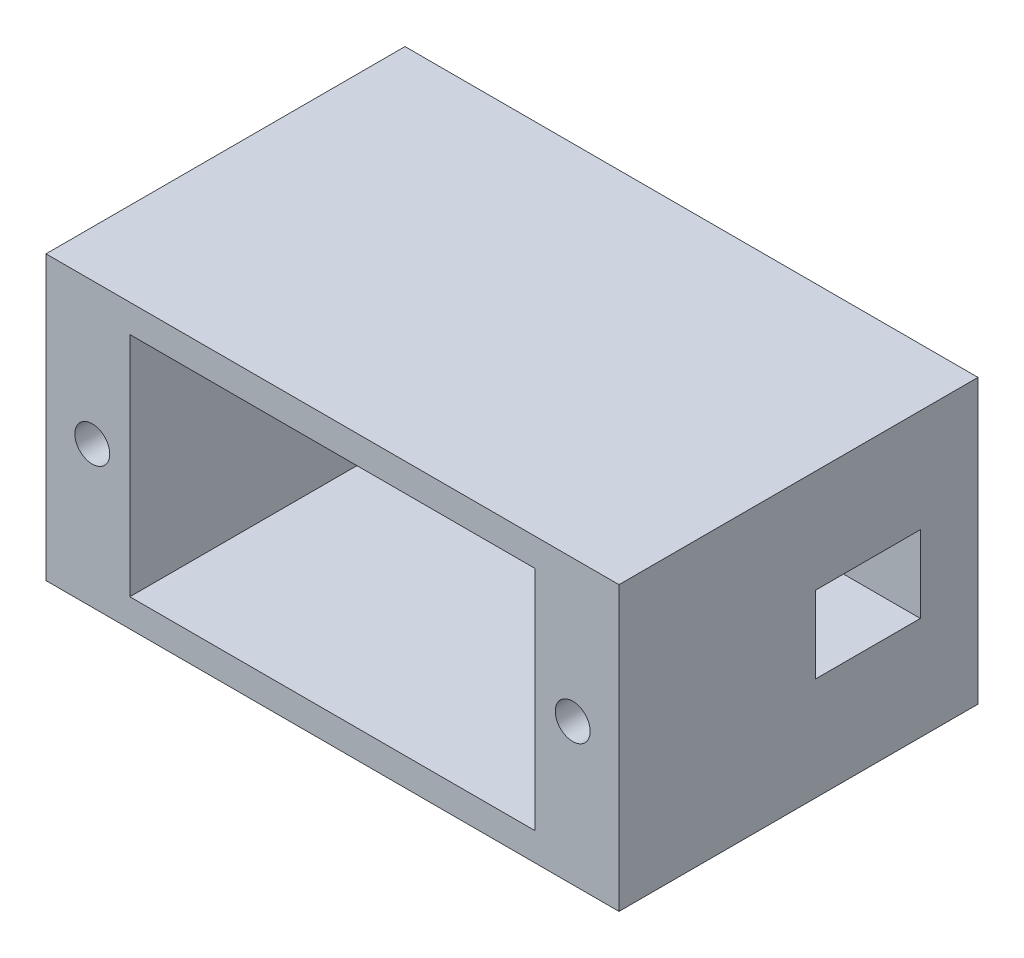
ISO-10303-21;
HEADER;
FILE_DESCRIPTION(('STEP AP214'),'2;1');
FILE_NAME('part.step','',(''),(''),'','','');
FILE_SCHEMA(('AUTOMOTIVE_DESIGN { 1 0 10303 214 1 1 1 1 }'));
ENDSEC;
DATA;
#1=APPLICATION_CONTEXT('core data for automotive mechanical design processes');
#2=APPLICATION_PROTOCOL_DEFINITION('international standard','automotive_design',2000,#1);
#3=PRODUCT_CONTEXT('',#1,'mechanical');
#4=PRODUCT('Part','Part','',(#3));
#5=PRODUCT_RELATED_PRODUCT_CATEGORY('part','',(#4));
#6=PRODUCT_DEFINITION_FORMATION('','',#4);
#7=PRODUCT_DEFINITION_CONTEXT('part definition',#1,'design');
#8=PRODUCT_DEFINITION('design','',#6,#7);
#9=PRODUCT_DEFINITION_SHAPE('','',#8);
#10=(LENGTH_UNIT() NAMED_UNIT(*) SI_UNIT(.MILLI.,.METRE.));
#11=(NAMED_UNIT(*) PLANE_ANGLE_UNIT() SI_UNIT($,.RADIAN.));
#12=(NAMED_UNIT(*) SI_UNIT($,.STERADIAN.) SOLID_ANGLE_UNIT());
#13=UNCERTAINTY_MEASURE_WITH_UNIT(LENGTH_MEASURE(1.E-05),#10,'distance_accuracy_value','');
#14=(GEOMETRIC_REPRESENTATION_CONTEXT(3) GLOBAL_UNCERTAINTY_ASSIGNED_CONTEXT((#13)) GLOBAL_UNIT_ASSIGNED_CONTEXT((#10,
#11,#12)) REPRESENTATION_CONTEXT('',''));
#15=CARTESIAN_POINT('',(0.,0.,0.));
#16=DIRECTION('',(0.,0.,1.));
#17=DIRECTION('',(1.,0.,0.));
#18=AXIS2_PLACEMENT_3D('',#15,#16,#17);
#19=CARTESIAN_POINT('',(-16.4,-8.1,5.15));
#20=DIRECTION('',(1.,0.,0.));
#21=DIRECTION('',(0.,0.,-1.));
#22=AXIS2_PLACEMENT_3D('',#19,#20,#21);
#23=PLANE('',#22);
#24=DIRECTION('',(0.,-1.,0.));
#25=VECTOR('',#24,1.);
#26=CARTESIAN_POINT('',(-16.4,-8.1,-15.4));
#27=LINE('',#26,#25);
#28=CARTESIAN_POINT('',(-16.4,8.1,-15.4));
#29=VERTEX_POINT('',#28);
#30=CARTESIAN_POINT('',(-16.4,-8.1,-15.4));
#31=VERTEX_POINT('',#30);
#32=EDGE_CURVE('E232',#29,#31,#27,.T.);
#33=ORIENTED_EDGE('',*,*,#32,.T.);
#34=DIRECTION('',(0.,0.,-1.));
#35=VECTOR('',#34,1.);
#36=CARTESIAN_POINT('',(-16.4,-8.1,5.15));
#37=LINE('',#36,#35);
#38=CARTESIAN_POINT('',(-16.4,-8.1,5.15));
#39=VERTEX_POINT('',#38);
#40=EDGE_CURVE('E11',#39,#31,#37,.T.);
#41=ORIENTED_EDGE('',*,*,#40,.F.);
#42=DIRECTION('',(0.,-1.,0.));
#43=VECTOR('',#42,1.);
#44=CARTESIAN_POINT('',(-16.4,-8.1,5.15));
#45=LINE('',#44,#43);
#46=CARTESIAN_POINT('',(-16.4,8.1,5.15));
#47=VERTEX_POINT('',#46);
#48=EDGE_CURVE('E242',#47,#39,#45,.T.);
#49=ORIENTED_EDGE('',*,*,#48,.F.);
#50=DIRECTION('',(0.,0.,-1.));
#51=VECTOR('',#50,1.);
#52=CARTESIAN_POINT('',(-16.4,8.1,5.15));
#53=LINE('',#52,#51);
#54=EDGE_CURVE('E256',#47,#29,#53,.T.);
#55=ORIENTED_EDGE('',*,*,#54,.T.);
#56=EDGE_LOOP('',(#33,#41,#49,#55));
#57=FACE_BOUND('',#56,.T.);
#58=ADVANCED_FACE('F39',(#57),#23,.F.);
#59=CARTESIAN_POINT('',(-16.4,-8.1,5.15));
#60=DIRECTION('',(0.,1.,0.));
#61=DIRECTION('',(0.,0.,1.));
#62=AXIS2_PLACEMENT_3D('',#59,#60,#61);
#63=PLANE('',#62);
#64=DIRECTION('',(1.,0.,0.));
#65=VECTOR('',#64,1.);
#66=CARTESIAN_POINT('',(-16.4,-8.1,-15.4));
#67=LINE('',#66,#65);
#68=CARTESIAN_POINT('',(16.4,-8.1,-15.4));
#69=VERTEX_POINT('',#68);
#70=EDGE_CURVE('E260',#31,#69,#67,.T.);
#71=ORIENTED_EDGE('',*,*,#70,.T.);
#72=DIRECTION('',(0.,0.,-1.));
#73=VECTOR('',#72,1.);
#74=CARTESIAN_POINT('',(16.4,-8.1,5.15));
#75=LINE('',#74,#73);
#76=CARTESIAN_POINT('',(16.4,-8.1,5.15));
#77=VERTEX_POINT('',#76);
#78=EDGE_CURVE('E47',#77,#69,#75,.T.);
#79=ORIENTED_EDGE('',*,*,#78,.F.);
#80=DIRECTION('',(1.,0.,0.));
#81=VECTOR('',#80,1.);
#82=CARTESIAN_POINT('',(-16.4,-8.1,5.15));
#83=LINE('',#82,#81);
#84=EDGE_CURVE('E246',#39,#77,#83,.T.);
#85=ORIENTED_EDGE('',*,*,#84,.F.);
#86=ORIENTED_EDGE('',*,*,#40,.T.);
#87=EDGE_LOOP('',(#71,#79,#85,#86));
#88=FACE_BOUND('',#87,.T.);
#89=ADVANCED_FACE('F296',(#88),#63,.F.);
#90=CARTESIAN_POINT('',(16.4,-8.1,5.15));
#91=DIRECTION('',(-1.,0.,0.));
#92=DIRECTION('',(0.,0.,1.));
#93=AXIS2_PLACEMENT_3D('',#90,#91,#92);
#94=PLANE('',#93);
#95=DIRECTION('',(0.,0.,-1.));
#96=VECTOR('',#95,1.);
#97=CARTESIAN_POINT('',(16.4,-2.2,-6.1));
#98=LINE('',#97,#96);
#99=CARTESIAN_POINT('',(16.4,-2.2,-6.1));
#100=VERTEX_POINT('',#99);
#101=CARTESIAN_POINT('',(16.4,-2.2,-12.1));
#102=VERTEX_POINT('',#101);
#103=EDGE_CURVE('E159',#100,#102,#98,.T.);
#104=ORIENTED_EDGE('',*,*,#103,.F.);
#105=DIRECTION('',(0.,-1.,0.));
#106=VECTOR('',#105,1.);
#107=CARTESIAN_POINT('',(16.4,-2.2,-6.1));
#108=LINE('',#107,#106);
#109=CARTESIAN_POINT('',(16.4,2.2,-6.1));
#110=VERTEX_POINT('',#109);
#111=EDGE_CURVE('E54',#110,#100,#108,.T.);
#112=ORIENTED_EDGE('',*,*,#111,.F.);
#113=DIRECTION('',(0.,0.,1.));
#114=VECTOR('',#113,1.);
#115=CARTESIAN_POINT('',(16.4,2.2,-6.1));
#116=LINE('',#115,#114);
#117=CARTESIAN_POINT('',(16.4,2.2,-12.1));
#118=VERTEX_POINT('',#117);
#119=EDGE_CURVE('E148',#118,#110,#116,.T.);
#120=ORIENTED_EDGE('',*,*,#119,.F.);
#121=DIRECTION('',(0.,1.,0.));
#122=VECTOR('',#121,1.);
#123=CARTESIAN_POINT('',(16.4,-2.2,-12.1));
#124=LINE('',#123,#122);
#125=EDGE_CURVE('E152',#102,#118,#124,.T.);
#126=ORIENTED_EDGE('',*,*,#125,.F.);
#127=EDGE_LOOP('',(#104,#112,#120,#126));
#128=FACE_BOUND('',#127,.T.);
#129=DIRECTION('',(0.,1.,0.));
#130=VECTOR('',#129,1.);
#131=CARTESIAN_POINT('',(16.4,-8.1,-15.4));
#132=LINE('',#131,#130);
#133=CARTESIAN_POINT('',(16.4,8.1,-15.4));
#134=VERTEX_POINT('',#133);
#135=EDGE_CURVE('E263',#69,#134,#132,.T.);
#136=ORIENTED_EDGE('',*,*,#135,.T.);
#137=DIRECTION('',(0.,0.,-1.));
#138=VECTOR('',#137,1.);
#139=CARTESIAN_POINT('',(16.4,8.1,5.15));
#140=LINE('',#139,#138);
#141=CARTESIAN_POINT('',(16.4,8.1,5.15));
#142=VERTEX_POINT('',#141);
#143=EDGE_CURVE('E271',#142,#134,#140,.T.);
#144=ORIENTED_EDGE('',*,*,#143,.F.);
#145=DIRECTION('',(0.,1.,0.));
#146=VECTOR('',#145,1.);
#147=CARTESIAN_POINT('',(16.4,-8.1,5.15));
#148=LINE('',#147,#146);
#149=EDGE_CURVE('E250',#77,#142,#148,.T.);
#150=ORIENTED_EDGE('',*,*,#149,.F.);
#151=ORIENTED_EDGE('',*,*,#78,.T.);
#152=EDGE_LOOP('',(#136,#144,#150,#151));
#153=FACE_BOUND('',#152,.T.);
#154=ADVANCED_FACE('F280',(#128,#153),#94,.F.);
#155=CARTESIAN_POINT('',(-16.4,8.1,5.15));
#156=DIRECTION('',(0.,-1.,0.));
#157=DIRECTION('',(0.,0.,-1.));
#158=AXIS2_PLACEMENT_3D('',#155,#156,#157);
#159=PLANE('',#158);
#160=DIRECTION('',(-1.,0.,0.));
#161=VECTOR('',#160,1.);
#162=CARTESIAN_POINT('',(-16.4,8.1,-15.4));
#163=LINE('',#162,#161);
#164=EDGE_CURVE('E247',#134,#29,#163,.T.);
#165=ORIENTED_EDGE('',*,*,#164,.T.);
#166=ORIENTED_EDGE('',*,*,#54,.F.);
#167=DIRECTION('',(-1.,0.,0.));
#168=VECTOR('',#167,1.);
#169=CARTESIAN_POINT('',(-16.4,8.1,5.15));
#170=LINE('',#169,#168);
#171=EDGE_CURVE('E253',#142,#47,#170,.T.);
#172=ORIENTED_EDGE('',*,*,#171,.F.);
#173=ORIENTED_EDGE('',*,*,#143,.T.);
#174=EDGE_LOOP('',(#165,#166,#172,#173));
#175=FACE_BOUND('',#174,.T.);
#176=ADVANCED_FACE('F289',(#175),#159,.F.);
#177=CARTESIAN_POINT('',(0.,0.,5.15));
#178=DIRECTION('',(0.,0.,-1.));
#179=DIRECTION('',(-1.,0.,0.));
#180=AXIS2_PLACEMENT_3D('',#177,#178,#179);
#181=PLANE('',#180);
#182=CARTESIAN_POINT('',(13.75,0.,5.15));
#183=DIRECTION('',(0.,0.,1.));
#184=DIRECTION('',(1.,0.,0.));
#185=AXIS2_PLACEMENT_3D('',#182,#183,#184);
#186=CIRCLE('',#185,0.999999999999999);
#187=CARTESIAN_POINT('',(14.75,0.,5.15));
#188=VERTEX_POINT('',#187);
#189=EDGE_CURVE('E178',#188,#188,#186,.T.);
#190=ORIENTED_EDGE('',*,*,#189,.F.);
#191=EDGE_LOOP('',(#190));
#192=FACE_BOUND('',#191,.T.);
#193=CARTESIAN_POINT('',(-13.75,0.,5.15));
#194=DIRECTION('',(0.,0.,1.));
#195=DIRECTION('',(1.,0.,0.));
#196=AXIS2_PLACEMENT_3D('',#193,#194,#195);
#197=CIRCLE('',#196,0.999999999999999);
#198=CARTESIAN_POINT('',(-12.75,0.,5.15));
#199=VERTEX_POINT('',#198);
#200=EDGE_CURVE('E186',#199,#199,#197,.T.);
#201=ORIENTED_EDGE('',*,*,#200,.F.);
#202=EDGE_LOOP('',(#201));
#203=FACE_BOUND('',#202,.T.);
#204=DIRECTION('',(1.,0.,0.));
#205=VECTOR('',#204,1.);
#206=CARTESIAN_POINT('',(-11.6,-6.5,5.15));
#207=LINE('',#206,#205);
#208=CARTESIAN_POINT('',(-11.6,-6.5,5.15));
#209=VERTEX_POINT('',#208);
#210=CARTESIAN_POINT('',(11.6,-6.5,5.15));
#211=VERTEX_POINT('',#210);
#212=EDGE_CURVE('E218',#209,#211,#207,.T.);
#213=ORIENTED_EDGE('',*,*,#212,.F.);
#214=DIRECTION('',(0.,-1.,0.));
#215=VECTOR('',#214,1.);
#216=CARTESIAN_POINT('',(-11.6,-6.5,5.15));
#217=LINE('',#216,#215);
#218=CARTESIAN_POINT('',(-11.6,6.5,5.15));
#219=VERTEX_POINT('',#218);
#220=EDGE_CURVE('E194',#219,#209,#217,.T.);
#221=ORIENTED_EDGE('',*,*,#220,.F.);
#222=DIRECTION('',(-1.,0.,0.));
#223=VECTOR('',#222,1.);
#224=CARTESIAN_POINT('',(-11.6,6.5,5.15));
#225=LINE('',#224,#223);
#226=CARTESIAN_POINT('',(11.6,6.5,5.15));
#227=VERTEX_POINT('',#226);
#228=EDGE_CURVE('E203',#227,#219,#225,.T.);
#229=ORIENTED_EDGE('',*,*,#228,.F.);
#230=DIRECTION('',(0.,1.,0.));
#231=VECTOR('',#230,1.);
#232=CARTESIAN_POINT('',(11.6,-6.5,5.15));
#233=LINE('',#232,#231);
#234=EDGE_CURVE('E222',#211,#227,#233,.T.);
#235=ORIENTED_EDGE('',*,*,#234,.F.);
#236=EDGE_LOOP('',(#213,#221,#229,#235));
#237=FACE_BOUND('',#236,.T.);
#238=ORIENTED_EDGE('',*,*,#48,.T.);
#239=ORIENTED_EDGE('',*,*,#84,.T.);
#240=ORIENTED_EDGE('',*,*,#149,.T.);
#241=ORIENTED_EDGE('',*,*,#171,.T.);
#242=EDGE_LOOP('',(#238,#239,#240,#241));
#243=FACE_BOUND('',#242,.T.);
#244=ADVANCED_FACE('F295',(#192,#203,#237,#243),#181,.F.);
#245=CARTESIAN_POINT('',(0.,0.,-15.4));
#246=DIRECTION('',(0.,0.,-1.));
#247=DIRECTION('',(-1.,0.,0.));
#248=AXIS2_PLACEMENT_3D('',#245,#246,#247);
#249=PLANE('',#248);
#250=CARTESIAN_POINT('',(5.5,0.,-15.4));
#251=DIRECTION('',(0.,0.,1.));
#252=DIRECTION('',(1.,0.,0.));
#253=AXIS2_PLACEMENT_3D('',#250,#251,#252);
#254=CIRCLE('',#253,3.15);
#255=CARTESIAN_POINT('',(8.65,0.,-15.4));
#256=VERTEX_POINT('',#255);
#257=EDGE_CURVE('E174',#256,#256,#254,.T.);
#258=ORIENTED_EDGE('',*,*,#257,.T.);
#259=EDGE_LOOP('',(#258));
#260=FACE_BOUND('',#259,.T.);
#261=ORIENTED_EDGE('',*,*,#32,.F.);
#262=ORIENTED_EDGE('',*,*,#164,.F.);
#263=ORIENTED_EDGE('',*,*,#135,.F.);
#264=ORIENTED_EDGE('',*,*,#70,.F.);
#265=EDGE_LOOP('',(#261,#262,#263,#264));
#266=FACE_BOUND('',#265,.T.);
#267=ADVANCED_FACE('F286',(#260,#266),#249,.T.);
#268=CARTESIAN_POINT('',(-11.6,-6.5,-12.1));
#269=DIRECTION('',(-1.,0.,0.));
#270=DIRECTION('',(0.,0.,1.));
#271=AXIS2_PLACEMENT_3D('',#268,#269,#270);
#272=PLANE('',#271);
#273=ORIENTED_EDGE('',*,*,#220,.T.);
#274=DIRECTION('',(0.,0.,1.));
#275=VECTOR('',#274,1.);
#276=CARTESIAN_POINT('',(-11.6,-6.5,-12.1));
#277=LINE('',#276,#275);
#278=CARTESIAN_POINT('',(-11.6,-6.5,-12.1));
#279=VERTEX_POINT('',#278);
#280=EDGE_CURVE('E215',#279,#209,#277,.T.);
#281=ORIENTED_EDGE('',*,*,#280,.F.);
#282=DIRECTION('',(0.,-1.,0.));
#283=VECTOR('',#282,1.);
#284=CARTESIAN_POINT('',(-11.6,-6.5,-12.1));
#285=LINE('',#284,#283);
#286=CARTESIAN_POINT('',(-11.6,6.5,-12.1));
#287=VERTEX_POINT('',#286);
#288=EDGE_CURVE('E198',#287,#279,#285,.T.);
#289=ORIENTED_EDGE('',*,*,#288,.F.);
#290=DIRECTION('',(0.,0.,1.));
#291=VECTOR('',#290,1.);
#292=CARTESIAN_POINT('',(-11.6,6.5,-12.1));
#293=LINE('',#292,#291);
#294=EDGE_CURVE('E229',#287,#219,#293,.T.);
#295=ORIENTED_EDGE('',*,*,#294,.T.);
#296=EDGE_LOOP('',(#273,#281,#289,#295));
#297=FACE_BOUND('',#296,.T.);
#298=ADVANCED_FACE('F309',(#297),#272,.F.);
#299=CARTESIAN_POINT('',(-11.6,6.5,-12.1));
#300=DIRECTION('',(0.,1.,0.));
#301=DIRECTION('',(0.,0.,1.));
#302=AXIS2_PLACEMENT_3D('',#299,#300,#301);
#303=PLANE('',#302);
#304=ORIENTED_EDGE('',*,*,#228,.T.);
#305=ORIENTED_EDGE('',*,*,#294,.F.);
#306=DIRECTION('',(-1.,0.,0.));
#307=VECTOR('',#306,1.);
#308=CARTESIAN_POINT('',(-11.6,6.5,-12.1));
#309=LINE('',#308,#307);
#310=CARTESIAN_POINT('',(11.6,6.5,-12.1));
#311=VERTEX_POINT('',#310);
#312=EDGE_CURVE('E211',#311,#287,#309,.T.);
#313=ORIENTED_EDGE('',*,*,#312,.F.);
#314=DIRECTION('',(0.,0.,1.));
#315=VECTOR('',#314,1.);
#316=CARTESIAN_POINT('',(11.6,6.5,-12.1));
#317=LINE('',#316,#315);
#318=EDGE_CURVE('E233',#311,#227,#317,.T.);
#319=ORIENTED_EDGE('',*,*,#318,.T.);
#320=EDGE_LOOP('',(#304,#305,#313,#319));
#321=FACE_BOUND('',#320,.T.);
#322=ADVANCED_FACE('F316',(#321),#303,.F.);
#323=CARTESIAN_POINT('',(11.6,-6.5,-12.1));
#324=DIRECTION('',(1.,0.,0.));
#325=DIRECTION('',(0.,0.,-1.));
#326=AXIS2_PLACEMENT_3D('',#323,#324,#325);
#327=PLANE('',#326);
#328=DIRECTION('',(0.,1.,0.));
#329=VECTOR('',#328,1.);
#330=CARTESIAN_POINT('',(11.6,-6.5,-12.1));
#331=LINE('',#330,#329);
#332=CARTESIAN_POINT('',(11.6,2.2,-12.1));
#333=VERTEX_POINT('',#332);
#334=EDGE_CURVE('E207',#333,#311,#331,.T.);
#335=ORIENTED_EDGE('',*,*,#334,.F.);
#336=DIRECTION('',(0.,0.,1.));
#337=VECTOR('',#336,1.);
#338=CARTESIAN_POINT('',(11.6,2.2,-6.1));
#339=LINE('',#338,#337);
#340=CARTESIAN_POINT('',(11.6,2.2,-6.1));
#341=VERTEX_POINT('',#340);
#342=EDGE_CURVE('E62',#333,#341,#339,.T.);
#343=ORIENTED_EDGE('',*,*,#342,.T.);
#344=DIRECTION('',(0.,-1.,0.));
#345=VECTOR('',#344,1.);
#346=CARTESIAN_POINT('',(11.6,-2.2,-6.1));
#347=LINE('',#346,#345);
#348=CARTESIAN_POINT('',(11.6,-2.2,-6.1));
#349=VERTEX_POINT('',#348);
#350=EDGE_CURVE('E130',#341,#349,#347,.T.);
#351=ORIENTED_EDGE('',*,*,#350,.T.);
#352=DIRECTION('',(0.,0.,-1.));
#353=VECTOR('',#352,1.);
#354=CARTESIAN_POINT('',(11.6,-2.2,-6.1));
#355=LINE('',#354,#353);
#356=CARTESIAN_POINT('',(11.6,-2.2,-12.1));
#357=VERTEX_POINT('',#356);
#358=EDGE_CURVE('E138',#349,#357,#355,.T.);
#359=ORIENTED_EDGE('',*,*,#358,.T.);
#360=CARTESIAN_POINT('',(11.6,-6.5,-12.1));
#361=VERTEX_POINT('',#360);
#362=EDGE_CURVE('E208',#361,#357,#331,.T.);
#363=ORIENTED_EDGE('',*,*,#362,.F.);
#364=DIRECTION('',(0.,0.,1.));
#365=VECTOR('',#364,1.);
#366=CARTESIAN_POINT('',(11.6,-6.5,-12.1));
#367=LINE('',#366,#365);
#368=EDGE_CURVE('E236',#361,#211,#367,.T.);
#369=ORIENTED_EDGE('',*,*,#368,.T.);
#370=ORIENTED_EDGE('',*,*,#234,.T.);
#371=ORIENTED_EDGE('',*,*,#318,.F.);
#372=EDGE_LOOP('',(#335,#343,#351,#359,#363,#369,#370,#371));
#373=FACE_BOUND('',#372,.T.);
#374=ADVANCED_FACE('F146',(#373),#327,.F.);
#375=CARTESIAN_POINT('',(-11.6,-6.5,-12.1));
#376=DIRECTION('',(0.,-1.,0.));
#377=DIRECTION('',(0.,0.,-1.));
#378=AXIS2_PLACEMENT_3D('',#375,#376,#377);
#379=PLANE('',#378);
#380=ORIENTED_EDGE('',*,*,#212,.T.);
#381=ORIENTED_EDGE('',*,*,#368,.F.);
#382=DIRECTION('',(1.,0.,0.));
#383=VECTOR('',#382,1.);
#384=CARTESIAN_POINT('',(-11.6,-6.5,-12.1));
#385=LINE('',#384,#383);
#386=EDGE_CURVE('E202',#279,#361,#385,.T.);
#387=ORIENTED_EDGE('',*,*,#386,.F.);
#388=ORIENTED_EDGE('',*,*,#280,.T.);
#389=EDGE_LOOP('',(#380,#381,#387,#388));
#390=FACE_BOUND('',#389,.T.);
#391=ADVANCED_FACE('F318',(#390),#379,.F.);
#392=CARTESIAN_POINT('',(0.,0.,-12.1));
#393=DIRECTION('',(0.,0.,-1.));
#394=DIRECTION('',(-1.,0.,0.));
#395=AXIS2_PLACEMENT_3D('',#392,#393,#394);
#396=PLANE('',#395);
#397=ORIENTED_EDGE('',*,*,#288,.T.);
#398=ORIENTED_EDGE('',*,*,#386,.T.);
#399=ORIENTED_EDGE('',*,*,#362,.T.);
#400=DIRECTION('',(1.,0.,0.));
#401=VECTOR('',#400,1.);
#402=CARTESIAN_POINT('',(11.6,-2.2,-12.1));
#403=LINE('',#402,#401);
#404=EDGE_CURVE('E135',#357,#102,#403,.T.);
#405=ORIENTED_EDGE('',*,*,#404,.T.);
#406=ORIENTED_EDGE('',*,*,#125,.T.);
#407=DIRECTION('',(1.,0.,0.));
#408=VECTOR('',#407,1.);
#409=CARTESIAN_POINT('',(11.6,2.2,-12.1));
#410=LINE('',#409,#408);
#411=EDGE_CURVE('E169',#333,#118,#410,.T.);
#412=ORIENTED_EDGE('',*,*,#411,.F.);
#413=ORIENTED_EDGE('',*,*,#334,.T.);
#414=ORIENTED_EDGE('',*,*,#312,.T.);
#415=EDGE_LOOP('',(#397,#398,#399,#405,#406,#412,#413,#414));
#416=FACE_BOUND('',#415,.T.);
#417=ADVANCED_FACE('F321',(#416),#396,.F.);
#418=CARTESIAN_POINT('',(-13.75,0.,-0.85));
#419=DIRECTION('',(0.,0.,1.));
#420=DIRECTION('',(1.,0.,0.));
#421=AXIS2_PLACEMENT_3D('',#418,#419,#420);
#422=CYLINDRICAL_SURFACE('',#421,0.999999999999999);
#423=CARTESIAN_POINT('',(-13.75,0.,-0.85));
#424=DIRECTION('',(0.,0.,1.));
#425=DIRECTION('',(1.,0.,0.));
#426=AXIS2_PLACEMENT_3D('',#423,#424,#425);
#427=CIRCLE('',#426,0.999999999999999);
#428=CARTESIAN_POINT('',(-12.75,0.,-0.85));
#429=VERTEX_POINT('',#428);
#430=EDGE_CURVE('E190',#429,#429,#427,.T.);
#431=ORIENTED_EDGE('',*,*,#430,.F.);
#432=EDGE_LOOP('',(#431));
#433=FACE_BOUND('',#432,.T.);
#434=ORIENTED_EDGE('',*,*,#200,.T.);
#435=EDGE_LOOP('',(#434));
#436=FACE_BOUND('',#435,.T.);
#437=ADVANCED_FACE('F330',(#433,#436),#422,.F.);
#438=CARTESIAN_POINT('',(-13.75,0.,-0.85));
#439=DIRECTION('',(0.,0.,1.));
#440=DIRECTION('',(1.,0.,0.));
#441=AXIS2_PLACEMENT_3D('',#438,#439,#440);
#442=PLANE('',#441);
#443=ORIENTED_EDGE('',*,*,#430,.T.);
#444=EDGE_LOOP('',(#443));
#445=FACE_BOUND('',#444,.T.);
#446=ADVANCED_FACE('F334',(#445),#442,.T.);
#447=CARTESIAN_POINT('',(13.75,0.,-0.85));
#448=DIRECTION('',(0.,0.,1.));
#449=DIRECTION('',(1.,0.,0.));
#450=AXIS2_PLACEMENT_3D('',#447,#448,#449);
#451=CYLINDRICAL_SURFACE('',#450,0.999999999999999);
#452=CARTESIAN_POINT('',(13.75,0.,-0.85));
#453=DIRECTION('',(0.,0.,1.));
#454=DIRECTION('',(1.,0.,0.));
#455=AXIS2_PLACEMENT_3D('',#452,#453,#454);
#456=CIRCLE('',#455,0.999999999999999);
#457=CARTESIAN_POINT('',(14.75,0.,-0.85));
#458=VERTEX_POINT('',#457);
#459=EDGE_CURVE('E182',#458,#458,#456,.T.);
#460=ORIENTED_EDGE('',*,*,#459,.F.);
#461=EDGE_LOOP('',(#460));
#462=FACE_BOUND('',#461,.T.);
#463=ORIENTED_EDGE('',*,*,#189,.T.);
#464=EDGE_LOOP('',(#463));
#465=FACE_BOUND('',#464,.T.);
#466=ADVANCED_FACE('F338',(#462,#465),#451,.F.);
#467=CARTESIAN_POINT('',(13.75,0.,-0.85));
#468=DIRECTION('',(0.,0.,1.));
#469=DIRECTION('',(1.,0.,0.));
#470=AXIS2_PLACEMENT_3D('',#467,#468,#469);
#471=PLANE('',#470);
#472=ORIENTED_EDGE('',*,*,#459,.T.);
#473=EDGE_LOOP('',(#472));
#474=FACE_BOUND('',#473,.T.);
#475=ADVANCED_FACE('F342',(#474),#471,.T.);
#476=CARTESIAN_POINT('',(5.5,0.,-15.4));
#477=DIRECTION('',(0.,0.,1.));
#478=DIRECTION('',(1.,0.,0.));
#479=AXIS2_PLACEMENT_3D('',#476,#477,#478);
#480=CYLINDRICAL_SURFACE('',#479,3.15);
#481=ORIENTED_EDGE('',*,*,#257,.F.);
#482=EDGE_LOOP('',(#481));
#483=FACE_BOUND('',#482,.T.);
#484=CARTESIAN_POINT('',(5.5,0.,-12.8));
#485=DIRECTION('',(0.,0.,1.));
#486=DIRECTION('',(1.,0.,0.));
#487=AXIS2_PLACEMENT_3D('',#484,#485,#486);
#488=CIRCLE('',#487,3.15);
#489=CARTESIAN_POINT('',(8.65,0.,-12.8));
#490=VERTEX_POINT('',#489);
#491=EDGE_CURVE('E168',#490,#490,#488,.T.);
#492=ORIENTED_EDGE('',*,*,#491,.T.);
#493=EDGE_LOOP('',(#492));
#494=FACE_BOUND('',#493,.T.);
#495=ADVANCED_FACE('F346',(#483,#494),#480,.F.);
#496=CARTESIAN_POINT('',(5.5,0.,-12.8));
#497=DIRECTION('',(0.,0.,1.));
#498=DIRECTION('',(1.,0.,0.));
#499=AXIS2_PLACEMENT_3D('',#496,#497,#498);
#500=PLANE('',#499);
#501=ORIENTED_EDGE('',*,*,#491,.F.);
#502=EDGE_LOOP('',(#501));
#503=FACE_BOUND('',#502,.T.);
#504=ADVANCED_FACE('F350',(#503),#500,.F.);
#505=CARTESIAN_POINT('',(11.6,-2.2,-6.1));
#506=DIRECTION('',(0.,0.,1.));
#507=DIRECTION('',(1.,0.,0.));
#508=AXIS2_PLACEMENT_3D('',#505,#506,#507);
#509=PLANE('',#508);
#510=ORIENTED_EDGE('',*,*,#111,.T.);
#511=DIRECTION('',(1.,0.,0.));
#512=VECTOR('',#511,1.);
#513=CARTESIAN_POINT('',(11.6,-2.2,-6.1));
#514=LINE('',#513,#512);
#515=EDGE_CURVE('E126',#349,#100,#514,.T.);
#516=ORIENTED_EDGE('',*,*,#515,.F.);
#517=ORIENTED_EDGE('',*,*,#350,.F.);
#518=DIRECTION('',(1.,0.,0.));
#519=VECTOR('',#518,1.);
#520=CARTESIAN_POINT('',(11.6,2.2,-6.1));
#521=LINE('',#520,#519);
#522=EDGE_CURVE('E165',#341,#110,#521,.T.);
#523=ORIENTED_EDGE('',*,*,#522,.T.);
#524=EDGE_LOOP('',(#510,#516,#517,#523));
#525=FACE_BOUND('',#524,.T.);
#526=ADVANCED_FACE('F128',(#525),#509,.F.);
#527=CARTESIAN_POINT('',(11.6,2.2,-6.1));
#528=DIRECTION('',(0.,1.,0.));
#529=DIRECTION('',(0.,0.,1.));
#530=AXIS2_PLACEMENT_3D('',#527,#528,#529);
#531=PLANE('',#530);
#532=ORIENTED_EDGE('',*,*,#119,.T.);
#533=ORIENTED_EDGE('',*,*,#522,.F.);
#534=ORIENTED_EDGE('',*,*,#342,.F.);
#535=ORIENTED_EDGE('',*,*,#411,.T.);
#536=EDGE_LOOP('',(#532,#533,#534,#535));
#537=FACE_BOUND('',#536,.T.);
#538=ADVANCED_FACE('F357',(#537),#531,.F.);
#539=CARTESIAN_POINT('',(11.6,-2.2,-6.1));
#540=DIRECTION('',(0.,-1.,0.));
#541=DIRECTION('',(0.,0.,-1.));
#542=AXIS2_PLACEMENT_3D('',#539,#540,#541);
#543=PLANE('',#542);
#544=ORIENTED_EDGE('',*,*,#103,.T.);
#545=ORIENTED_EDGE('',*,*,#404,.F.);
#546=ORIENTED_EDGE('',*,*,#358,.F.);
#547=ORIENTED_EDGE('',*,*,#515,.T.);
#548=EDGE_LOOP('',(#544,#545,#546,#547));
#549=FACE_BOUND('',#548,.T.);
#550=ADVANCED_FACE('F139',(#549),#543,.F.);
#551=CLOSED_SHELL('',(#58,#89,#154,#176,#244,#267,#298,#322,#374,#391,#417,#437,#446,#466,#475,
#495,#504,#526,#538,#550));
#552=MANIFOLD_SOLID_BREP('B2',#551);
#553=ADVANCED_BREP_SHAPE_REPRESENTATION('',(#18,#552),#14);
#554=SHAPE_DEFINITION_REPRESENTATION(#9,#553);
ENDSEC;
END-ISO-10303-21;
